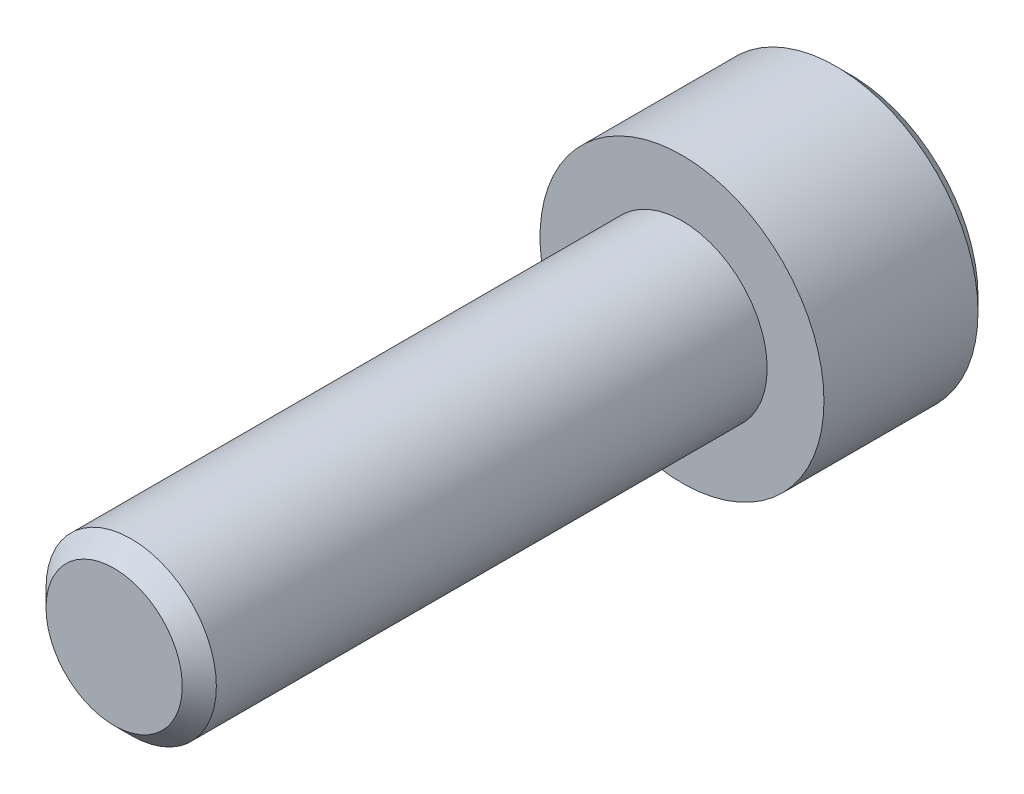
ISO-10303-21;
HEADER;
FILE_DESCRIPTION(('STEP AP214'),'2;1');
FILE_NAME('part.step','',(''),(''),'','','');
FILE_SCHEMA(('AUTOMOTIVE_DESIGN { 1 0 10303 214 1 1 1 1 }'));
ENDSEC;
DATA;
#1=APPLICATION_CONTEXT('core data for automotive mechanical design processes');
#2=APPLICATION_PROTOCOL_DEFINITION('international standard','automotive_design',2000,#1);
#3=PRODUCT_CONTEXT('',#1,'mechanical');
#4=PRODUCT('Part','Part','',(#3));
#5=PRODUCT_RELATED_PRODUCT_CATEGORY('part','',(#4));
#6=PRODUCT_DEFINITION_FORMATION('','',#4);
#7=PRODUCT_DEFINITION_CONTEXT('part definition',#1,'design');
#8=PRODUCT_DEFINITION('design','',#6,#7);
#9=PRODUCT_DEFINITION_SHAPE('','',#8);
#10=(LENGTH_UNIT() NAMED_UNIT(*) SI_UNIT(.MILLI.,.METRE.));
#11=(NAMED_UNIT(*) PLANE_ANGLE_UNIT() SI_UNIT($,.RADIAN.));
#12=(NAMED_UNIT(*) SI_UNIT($,.STERADIAN.) SOLID_ANGLE_UNIT());
#13=UNCERTAINTY_MEASURE_WITH_UNIT(LENGTH_MEASURE(1.E-05),#10,'distance_accuracy_value','');
#14=(GEOMETRIC_REPRESENTATION_CONTEXT(3) GLOBAL_UNCERTAINTY_ASSIGNED_CONTEXT((#13)) GLOBAL_UNIT_ASSIGNED_CONTEXT((#10,
#11,#12)) REPRESENTATION_CONTEXT('',''));
#15=CARTESIAN_POINT('',(0.,0.,0.));
#16=DIRECTION('',(0.,0.,1.));
#17=DIRECTION('',(1.,0.,0.));
#18=AXIS2_PLACEMENT_3D('',#15,#16,#17);
#19=CARTESIAN_POINT('',(0.,0.,-2.925));
#20=DIRECTION('',(0.,0.,1.));
#21=DIRECTION('',(1.,0.,0.));
#22=AXIS2_PLACEMENT_3D('',#19,#20,#21);
#23=PLANE('',#22);
#24=DIRECTION('',(0.866025403784439,0.499999999999999,0.));
#25=VECTOR('',#24,1.);
#26=CARTESIAN_POINT('',(2.5,-1.44337567297406,-2.925));
#27=LINE('',#26,#25);
#28=CARTESIAN_POINT('',(2.5,-1.44337567297406,-2.925));
#29=VERTEX_POINT('',#28);
#30=CARTESIAN_POINT('',(0.,-2.88675134594813,-2.925));
#31=VERTEX_POINT('',#30);
#32=EDGE_CURVE('E68',#29,#31,#27,.F.);
#33=ORIENTED_EDGE('',*,*,#32,.T.);
#34=DIRECTION('',(0.866025403784438,-0.5,0.));
#35=VECTOR('',#34,1.);
#36=CARTESIAN_POINT('',(0.,-2.88675134594813,-2.925));
#37=LINE('',#36,#35);
#38=CARTESIAN_POINT('',(-2.5,-1.44337567297406,-2.925));
#39=VERTEX_POINT('',#38);
#40=EDGE_CURVE('E91',#31,#39,#37,.F.);
#41=ORIENTED_EDGE('',*,*,#40,.T.);
#42=DIRECTION('',(0.,1.,0.));
#43=VECTOR('',#42,1.);
#44=CARTESIAN_POINT('',(-2.5,-1.44337567297406,-2.925));
#45=LINE('',#44,#43);
#46=CARTESIAN_POINT('',(-2.5,1.44337567297406,-2.925));
#47=VERTEX_POINT('',#46);
#48=EDGE_CURVE('E130',#39,#47,#45,.T.);
#49=ORIENTED_EDGE('',*,*,#48,.T.);
#50=DIRECTION('',(-0.866025403784439,-0.5,0.));
#51=VECTOR('',#50,1.);
#52=CARTESIAN_POINT('',(-2.5,1.44337567297406,-2.925));
#53=LINE('',#52,#51);
#54=CARTESIAN_POINT('',(0.,2.88675134594813,-2.925));
#55=VERTEX_POINT('',#54);
#56=EDGE_CURVE('E125',#47,#55,#53,.F.);
#57=ORIENTED_EDGE('',*,*,#56,.T.);
#58=DIRECTION('',(-0.866025403784439,0.5,0.));
#59=VECTOR('',#58,1.);
#60=CARTESIAN_POINT('',(0.,2.88675134594813,-2.925));
#61=LINE('',#60,#59);
#62=CARTESIAN_POINT('',(2.5,1.44337567297406,-2.925));
#63=VERTEX_POINT('',#62);
#64=EDGE_CURVE('E74',#55,#63,#61,.F.);
#65=ORIENTED_EDGE('',*,*,#64,.T.);
#66=DIRECTION('',(0.,1.,0.));
#67=VECTOR('',#66,1.);
#68=CARTESIAN_POINT('',(2.5,1.44337567297406,-2.925));
#69=LINE('',#68,#67);
#70=EDGE_CURVE('E71',#63,#29,#69,.F.);
#71=ORIENTED_EDGE('',*,*,#70,.T.);
#72=EDGE_LOOP('',(#33,#41,#49,#57,#65,#71));
#73=FACE_BOUND('',#72,.T.);
#74=ADVANCED_FACE('F17',(#73),#23,.F.);
#75=CARTESIAN_POINT('',(2.5,1.44337567297406,-5.925));
#76=DIRECTION('',(1.,0.,0.));
#77=DIRECTION('',(0.,0.,-1.));
#78=AXIS2_PLACEMENT_3D('',#75,#76,#77);
#79=PLANE('',#78);
#80=ORIENTED_EDGE('',*,*,#70,.F.);
#81=DIRECTION('',(0.,0.,1.));
#82=VECTOR('',#81,1.);
#83=CARTESIAN_POINT('',(2.5,1.44337567297406,-5.925));
#84=LINE('',#83,#82);
#85=CARTESIAN_POINT('',(2.5,1.44337567297406,-5.925));
#86=VERTEX_POINT('',#85);
#87=EDGE_CURVE('E120',#63,#86,#84,.F.);
#88=ORIENTED_EDGE('',*,*,#87,.T.);
#89=DIRECTION('',(0.,1.,0.));
#90=VECTOR('',#89,1.);
#91=CARTESIAN_POINT('',(2.5,0.,-5.925));
#92=LINE('',#91,#90);
#93=CARTESIAN_POINT('',(2.5,-1.44337567297406,-5.925));
#94=VERTEX_POINT('',#93);
#95=EDGE_CURVE('E82',#86,#94,#92,.F.);
#96=ORIENTED_EDGE('',*,*,#95,.T.);
#97=DIRECTION('',(0.,0.,1.));
#98=VECTOR('',#97,1.);
#99=CARTESIAN_POINT('',(2.5,-1.44337567297406,-5.925));
#100=LINE('',#99,#98);
#101=EDGE_CURVE('E77',#94,#29,#100,.T.);
#102=ORIENTED_EDGE('',*,*,#101,.T.);
#103=EDGE_LOOP('',(#80,#88,#96,#102));
#104=FACE_BOUND('',#103,.T.);
#105=ADVANCED_FACE('F80',(#104),#79,.F.);
#106=CARTESIAN_POINT('',(2.5,-1.44337567297406,-5.925));
#107=DIRECTION('',(0.499999999999999,-0.866025403784439,0.));
#108=DIRECTION('',(0.866025403784439,0.499999999999999,0.));
#109=AXIS2_PLACEMENT_3D('',#106,#107,#108);
#110=PLANE('',#109);
#111=ORIENTED_EDGE('',*,*,#32,.F.);
#112=ORIENTED_EDGE('',*,*,#101,.F.);
#113=DIRECTION('',(-0.866025403784438,-0.500000000000001,0.));
#114=VECTOR('',#113,1.);
#115=CARTESIAN_POINT('',(2.5,-1.44337567297406,-5.925));
#116=LINE('',#115,#114);
#117=CARTESIAN_POINT('',(0.,-2.88675134594813,-5.925));
#118=VERTEX_POINT('',#117);
#119=EDGE_CURVE('E117',#94,#118,#116,.T.);
#120=ORIENTED_EDGE('',*,*,#119,.T.);
#121=DIRECTION('',(0.,0.,1.));
#122=VECTOR('',#121,1.);
#123=CARTESIAN_POINT('',(0.,-2.88675134594813,-5.925));
#124=LINE('',#123,#122);
#125=EDGE_CURVE('E88',#118,#31,#124,.T.);
#126=ORIENTED_EDGE('',*,*,#125,.T.);
#127=EDGE_LOOP('',(#111,#112,#120,#126));
#128=FACE_BOUND('',#127,.T.);
#129=ADVANCED_FACE('F86',(#128),#110,.F.);
#130=CARTESIAN_POINT('',(0.,-2.88675134594813,-5.925));
#131=DIRECTION('',(-0.5,-0.866025403784438,0.));
#132=DIRECTION('',(0.866025403784438,-0.5,0.));
#133=AXIS2_PLACEMENT_3D('',#130,#131,#132);
#134=PLANE('',#133);
#135=ORIENTED_EDGE('',*,*,#40,.F.);
#136=ORIENTED_EDGE('',*,*,#125,.F.);
#137=DIRECTION('',(-0.866025403784438,0.500000000000002,0.));
#138=VECTOR('',#137,1.);
#139=CARTESIAN_POINT('',(0.,-2.88675134594813,-5.925));
#140=LINE('',#139,#138);
#141=CARTESIAN_POINT('',(-2.5,-1.44337567297406,-5.925));
#142=VERTEX_POINT('',#141);
#143=EDGE_CURVE('E115',#118,#142,#140,.T.);
#144=ORIENTED_EDGE('',*,*,#143,.T.);
#145=DIRECTION('',(0.,0.,1.));
#146=VECTOR('',#145,1.);
#147=CARTESIAN_POINT('',(-2.5,-1.44337567297406,-5.925));
#148=LINE('',#147,#146);
#149=EDGE_CURVE('E132',#142,#39,#148,.T.);
#150=ORIENTED_EDGE('',*,*,#149,.T.);
#151=EDGE_LOOP('',(#135,#136,#144,#150));
#152=FACE_BOUND('',#151,.T.);
#153=ADVANCED_FACE('F137',(#152),#134,.F.);
#154=CARTESIAN_POINT('',(-2.5,-1.44337567297406,-5.925));
#155=DIRECTION('',(-1.,0.,0.));
#156=DIRECTION('',(0.,0.,1.));
#157=AXIS2_PLACEMENT_3D('',#154,#155,#156);
#158=PLANE('',#157);
#159=ORIENTED_EDGE('',*,*,#48,.F.);
#160=ORIENTED_EDGE('',*,*,#149,.F.);
#161=DIRECTION('',(0.,1.,0.));
#162=VECTOR('',#161,1.);
#163=CARTESIAN_POINT('',(-2.5,0.,-5.925));
#164=LINE('',#163,#162);
#165=CARTESIAN_POINT('',(-2.5,1.44337567297406,-5.925));
#166=VERTEX_POINT('',#165);
#167=EDGE_CURVE('E113',#142,#166,#164,.T.);
#168=ORIENTED_EDGE('',*,*,#167,.T.);
#169=DIRECTION('',(0.,0.,1.));
#170=VECTOR('',#169,1.);
#171=CARTESIAN_POINT('',(-2.5,1.44337567297406,-5.925));
#172=LINE('',#171,#170);
#173=EDGE_CURVE('E127',#166,#47,#172,.T.);
#174=ORIENTED_EDGE('',*,*,#173,.T.);
#175=EDGE_LOOP('',(#159,#160,#168,#174));
#176=FACE_BOUND('',#175,.T.);
#177=ADVANCED_FACE('F141',(#176),#158,.F.);
#178=CARTESIAN_POINT('',(-2.5,1.44337567297406,-5.925));
#179=DIRECTION('',(-0.5,0.866025403784439,0.));
#180=DIRECTION('',(-0.866025403784439,-0.5,0.));
#181=AXIS2_PLACEMENT_3D('',#178,#179,#180);
#182=PLANE('',#181);
#183=ORIENTED_EDGE('',*,*,#56,.F.);
#184=ORIENTED_EDGE('',*,*,#173,.F.);
#185=DIRECTION('',(0.866025403784438,0.500000000000001,0.));
#186=VECTOR('',#185,1.);
#187=CARTESIAN_POINT('',(-2.5,1.44337567297406,-5.925));
#188=LINE('',#187,#186);
#189=CARTESIAN_POINT('',(0.,2.88675134594813,-5.925));
#190=VERTEX_POINT('',#189);
#191=EDGE_CURVE('E35',#166,#190,#188,.T.);
#192=ORIENTED_EDGE('',*,*,#191,.T.);
#193=DIRECTION('',(0.,0.,1.));
#194=VECTOR('',#193,1.);
#195=CARTESIAN_POINT('',(0.,2.88675134594813,-5.925));
#196=LINE('',#195,#194);
#197=EDGE_CURVE('E123',#190,#55,#196,.T.);
#198=ORIENTED_EDGE('',*,*,#197,.T.);
#199=EDGE_LOOP('',(#183,#184,#192,#198));
#200=FACE_BOUND('',#199,.T.);
#201=ADVANCED_FACE('F143',(#200),#182,.F.);
#202=CARTESIAN_POINT('',(0.,2.88675134594813,-5.925));
#203=DIRECTION('',(0.5,0.866025403784439,0.));
#204=DIRECTION('',(-0.866025403784439,0.5,0.));
#205=AXIS2_PLACEMENT_3D('',#202,#203,#204);
#206=PLANE('',#205);
#207=ORIENTED_EDGE('',*,*,#64,.F.);
#208=ORIENTED_EDGE('',*,*,#197,.F.);
#209=DIRECTION('',(0.866025403784438,-0.500000000000001,0.));
#210=VECTOR('',#209,1.);
#211=CARTESIAN_POINT('',(0.,2.88675134594813,-5.925));
#212=LINE('',#211,#210);
#213=EDGE_CURVE('E107',#190,#86,#212,.T.);
#214=ORIENTED_EDGE('',*,*,#213,.T.);
#215=ORIENTED_EDGE('',*,*,#87,.F.);
#216=EDGE_LOOP('',(#207,#208,#214,#215));
#217=FACE_BOUND('',#216,.T.);
#218=ADVANCED_FACE('F146',(#217),#206,.F.);
#219=CARTESIAN_POINT('',(0.,0.,-5.925));
#220=DIRECTION('',(0.,0.,1.));
#221=DIRECTION('',(1.,0.,0.));
#222=AXIS2_PLACEMENT_3D('',#219,#220,#221);
#223=PLANE('',#222);
#224=ORIENTED_EDGE('',*,*,#191,.F.);
#225=ORIENTED_EDGE('',*,*,#167,.F.);
#226=ORIENTED_EDGE('',*,*,#143,.F.);
#227=ORIENTED_EDGE('',*,*,#119,.F.);
#228=ORIENTED_EDGE('',*,*,#95,.F.);
#229=ORIENTED_EDGE('',*,*,#213,.F.);
#230=EDGE_LOOP('',(#224,#225,#226,#227,#228,#229));
#231=FACE_BOUND('',#230,.T.);
#232=CARTESIAN_POINT('',(0.,0.,-5.92499999999063));
#233=DIRECTION('',(0.,0.,1.));
#234=DIRECTION('',(1.,0.,0.));
#235=AXIS2_PLACEMENT_3D('',#232,#233,#234);
#236=CIRCLE('',#235,4.50000000000728);
#237=CARTESIAN_POINT('',(4.50000000000728,0.,-5.92499999999063));
#238=VERTEX_POINT('',#237);
#239=EDGE_CURVE('E20',#238,#238,#236,.T.);
#240=ORIENTED_EDGE('',*,*,#239,.F.);
#241=EDGE_LOOP('',(#240));
#242=FACE_BOUND('',#241,.T.);
#243=ADVANCED_FACE('F148',(#231,#242),#223,.F.);
#244=CARTESIAN_POINT('',(0.,0.,-5.42500000000246));
#245=DIRECTION('',(0.,0.,1.));
#246=DIRECTION('',(1.,0.,0.));
#247=AXIS2_PLACEMENT_3D('',#244,#245,#246);
#248=CONICAL_SURFACE('',#247,4.99999999999545,0.785398163397448);
#249=ORIENTED_EDGE('',*,*,#239,.T.);
#250=EDGE_LOOP('',(#249));
#251=FACE_BOUND('',#250,.T.);
#252=CARTESIAN_POINT('',(0.,0.,-5.425));
#253=DIRECTION('',(0.,0.,1.));
#254=DIRECTION('',(1.,0.,0.));
#255=AXIS2_PLACEMENT_3D('',#252,#253,#254);
#256=CIRCLE('',#255,5.);
#257=CARTESIAN_POINT('',(5.,0.,-5.425));
#258=VERTEX_POINT('',#257);
#259=EDGE_CURVE('E99',#258,#258,#256,.T.);
#260=ORIENTED_EDGE('',*,*,#259,.F.);
#261=EDGE_LOOP('',(#260));
#262=FACE_BOUND('',#261,.T.);
#263=ADVANCED_FACE('F151',(#251,#262),#248,.T.);
#264=CARTESIAN_POINT('',(0.,0.,20.));
#265=DIRECTION('',(0.,0.,1.));
#266=DIRECTION('',(1.,0.,0.));
#267=AXIS2_PLACEMENT_3D('',#264,#265,#266);
#268=PLANE('',#267);
#269=CARTESIAN_POINT('',(0.,0.,19.999999999925));
#270=DIRECTION('',(0.,0.,-1.));
#271=DIRECTION('',(-1.,0.,0.));
#272=AXIS2_PLACEMENT_3D('',#269,#270,#271);
#273=CIRCLE('',#272,2.40000000002283);
#274=CARTESIAN_POINT('',(-2.40000000002283,0.,19.999999999925));
#275=VERTEX_POINT('',#274);
#276=EDGE_CURVE('E97',#275,#275,#273,.T.);
#277=ORIENTED_EDGE('',*,*,#276,.F.);
#278=EDGE_LOOP('',(#277));
#279=FACE_BOUND('',#278,.T.);
#280=ADVANCED_FACE('F157',(#279),#268,.T.);
#281=CARTESIAN_POINT('',(0.,0.,-5.925));
#282=DIRECTION('',(0.,0.,1.));
#283=DIRECTION('',(1.,0.,0.));
#284=AXIS2_PLACEMENT_3D('',#281,#282,#283);
#285=CYLINDRICAL_SURFACE('',#284,5.);
#286=ORIENTED_EDGE('',*,*,#259,.T.);
#287=EDGE_LOOP('',(#286));
#288=FACE_BOUND('',#287,.T.);
#289=CARTESIAN_POINT('',(0.,0.,0.));
#290=DIRECTION('',(0.,0.,1.));
#291=DIRECTION('',(1.,0.,0.));
#292=AXIS2_PLACEMENT_3D('',#289,#290,#291);
#293=CIRCLE('',#292,5.);
#294=CARTESIAN_POINT('',(5.,0.,0.));
#295=VERTEX_POINT('',#294);
#296=EDGE_CURVE('E95',#295,#295,#293,.T.);
#297=ORIENTED_EDGE('',*,*,#296,.F.);
#298=EDGE_LOOP('',(#297));
#299=FACE_BOUND('',#298,.T.);
#300=ADVANCED_FACE('F163',(#288,#299),#285,.T.);
#301=CARTESIAN_POINT('',(0.,0.,19.4000000000187));
#302=DIRECTION('',(0.,0.,-1.));
#303=DIRECTION('',(-1.,0.,0.));
#304=AXIS2_PLACEMENT_3D('',#301,#302,#303);
#305=CONICAL_SURFACE('',#304,2.9999999999859,0.785398163444818);
#306=CARTESIAN_POINT('',(0.,0.,19.4));
#307=DIRECTION('',(0.,0.,1.));
#308=DIRECTION('',(1.,0.,0.));
#309=AXIS2_PLACEMENT_3D('',#306,#307,#308);
#310=CIRCLE('',#309,3.);
#311=CARTESIAN_POINT('',(3.,0.,19.4));
#312=VERTEX_POINT('',#311);
#313=EDGE_CURVE('E26',#312,#312,#310,.F.);
#314=ORIENTED_EDGE('',*,*,#313,.F.);
#315=EDGE_LOOP('',(#314));
#316=FACE_BOUND('',#315,.T.);
#317=ORIENTED_EDGE('',*,*,#276,.T.);
#318=EDGE_LOOP('',(#317));
#319=FACE_BOUND('',#318,.T.);
#320=ADVANCED_FACE('F174',(#316,#319),#305,.T.);
#321=CARTESIAN_POINT('',(0.,0.,0.));
#322=DIRECTION('',(0.,0.,1.));
#323=DIRECTION('',(1.,0.,0.));
#324=AXIS2_PLACEMENT_3D('',#321,#322,#323);
#325=PLANE('',#324);
#326=CARTESIAN_POINT('',(0.,0.,0.));
#327=DIRECTION('',(0.,0.,1.));
#328=DIRECTION('',(1.,0.,0.));
#329=AXIS2_PLACEMENT_3D('',#326,#327,#328);
#330=CIRCLE('',#329,3.);
#331=CARTESIAN_POINT('',(3.,0.,0.));
#332=VERTEX_POINT('',#331);
#333=EDGE_CURVE('E11',#332,#332,#330,.T.);
#334=ORIENTED_EDGE('',*,*,#333,.F.);
#335=EDGE_LOOP('',(#334));
#336=FACE_BOUND('',#335,.T.);
#337=ORIENTED_EDGE('',*,*,#296,.T.);
#338=EDGE_LOOP('',(#337));
#339=FACE_BOUND('',#338,.T.);
#340=ADVANCED_FACE('F168',(#336,#339),#325,.T.);
#341=CARTESIAN_POINT('',(0.,0.,0.));
#342=DIRECTION('',(0.,0.,1.));
#343=DIRECTION('',(1.,0.,0.));
#344=AXIS2_PLACEMENT_3D('',#341,#342,#343);
#345=CYLINDRICAL_SURFACE('',#344,3.);
#346=ORIENTED_EDGE('',*,*,#333,.T.);
#347=EDGE_LOOP('',(#346));
#348=FACE_BOUND('',#347,.T.);
#349=ORIENTED_EDGE('',*,*,#313,.T.);
#350=EDGE_LOOP('',(#349));
#351=FACE_BOUND('',#350,.T.);
#352=ADVANCED_FACE('F166',(#348,#351),#345,.T.);
#353=CLOSED_SHELL('',(#74,#105,#129,#153,#177,#201,#218,#243,#263,#280,#300,#320,#340,#352));
#354=MANIFOLD_SOLID_BREP('B1',#353);
#355=ADVANCED_BREP_SHAPE_REPRESENTATION('',(#18,#354),#14);
#356=SHAPE_DEFINITION_REPRESENTATION(#9,#355);
ENDSEC;
END-ISO-10303-21;
